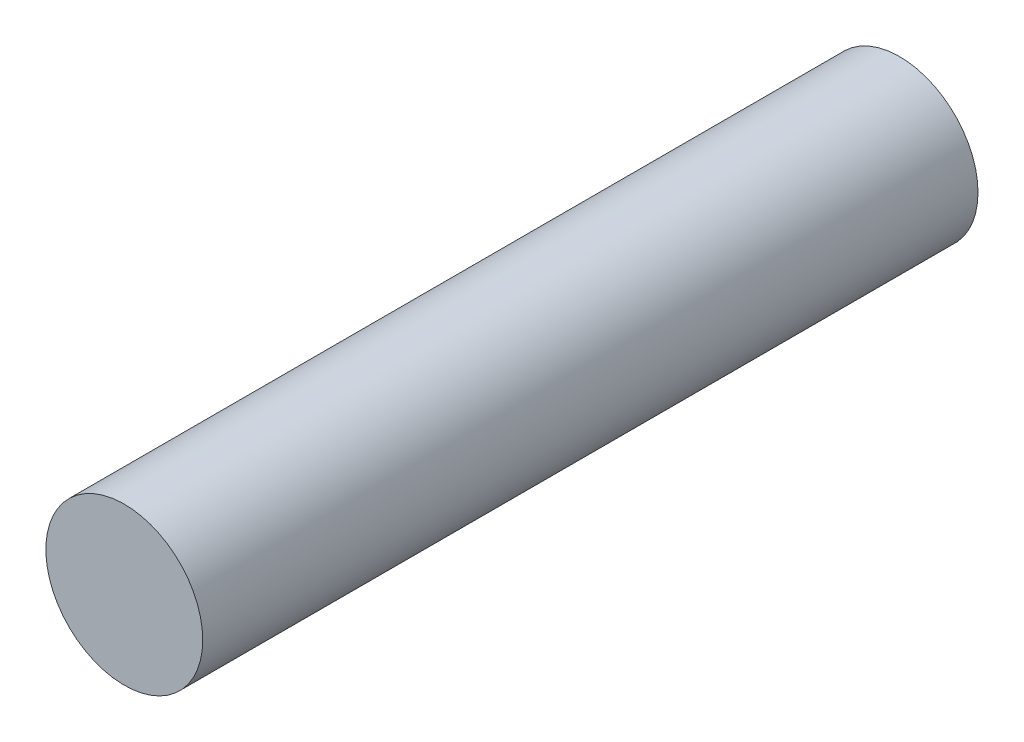
ISO-10303-21;
HEADER;
FILE_DESCRIPTION(('STEP AP214'),'2;1');
FILE_NAME('part.step','',(''),(''),'','','');
FILE_SCHEMA(('AUTOMOTIVE_DESIGN { 1 0 10303 214 1 1 1 1 }'));
ENDSEC;
DATA;
#1=APPLICATION_CONTEXT('core data for automotive mechanical design processes');
#2=APPLICATION_PROTOCOL_DEFINITION('international standard','automotive_design',2000,#1);
#3=PRODUCT_CONTEXT('',#1,'mechanical');
#4=PRODUCT('Part','Part','',(#3));
#5=PRODUCT_RELATED_PRODUCT_CATEGORY('part','',(#4));
#6=PRODUCT_DEFINITION_FORMATION('','',#4);
#7=PRODUCT_DEFINITION_CONTEXT('part definition',#1,'design');
#8=PRODUCT_DEFINITION('design','',#6,#7);
#9=PRODUCT_DEFINITION_SHAPE('','',#8);
#10=(LENGTH_UNIT() NAMED_UNIT(*) SI_UNIT(.MILLI.,.METRE.));
#11=(NAMED_UNIT(*) PLANE_ANGLE_UNIT() SI_UNIT($,.RADIAN.));
#12=(NAMED_UNIT(*) SI_UNIT($,.STERADIAN.) SOLID_ANGLE_UNIT());
#13=UNCERTAINTY_MEASURE_WITH_UNIT(LENGTH_MEASURE(1.E-05),#10,'distance_accuracy_value','');
#14=(GEOMETRIC_REPRESENTATION_CONTEXT(3) GLOBAL_UNCERTAINTY_ASSIGNED_CONTEXT((#13)) GLOBAL_UNIT_ASSIGNED_CONTEXT((#10,
#11,#12)) REPRESENTATION_CONTEXT('',''));
#15=CARTESIAN_POINT('',(0.,0.,0.));
#16=DIRECTION('',(0.,0.,1.));
#17=DIRECTION('',(1.,0.,0.));
#18=AXIS2_PLACEMENT_3D('',#15,#16,#17);
#19=CARTESIAN_POINT('',(0.,0.,8.4));
#20=DIRECTION('',(0.,0.,-1.));
#21=DIRECTION('',(-1.,0.,0.));
#22=AXIS2_PLACEMENT_3D('',#19,#20,#21);
#23=CYLINDRICAL_SURFACE('',#22,0.85);
#24=CARTESIAN_POINT('',(0.,0.,8.4));
#25=DIRECTION('',(0.,0.,1.));
#26=DIRECTION('',(1.,0.,0.));
#27=AXIS2_PLACEMENT_3D('',#24,#25,#26);
#28=CIRCLE('',#27,0.85);
#29=CARTESIAN_POINT('',(0.85,0.,8.4));
#30=VERTEX_POINT('',#29);
#31=EDGE_CURVE('E10',#30,#30,#28,.T.);
#32=ORIENTED_EDGE('',*,*,#31,.F.);
#33=EDGE_LOOP('',(#32));
#34=FACE_BOUND('',#33,.T.);
#35=CARTESIAN_POINT('',(0.,0.,0.));
#36=DIRECTION('',(0.,0.,1.));
#37=DIRECTION('',(1.,0.,0.));
#38=AXIS2_PLACEMENT_3D('',#35,#36,#37);
#39=CIRCLE('',#38,0.85);
#40=CARTESIAN_POINT('',(0.85,0.,0.));
#41=VERTEX_POINT('',#40);
#42=EDGE_CURVE('E35',#41,#41,#39,.T.);
#43=ORIENTED_EDGE('',*,*,#42,.T.);
#44=EDGE_LOOP('',(#43));
#45=FACE_BOUND('',#44,.T.);
#46=ADVANCED_FACE('F32',(#34,#45),#23,.T.);
#47=CARTESIAN_POINT('',(0.,0.,8.4));
#48=DIRECTION('',(0.,0.,1.));
#49=DIRECTION('',(1.,0.,0.));
#50=AXIS2_PLACEMENT_3D('',#47,#48,#49);
#51=PLANE('',#50);
#52=ORIENTED_EDGE('',*,*,#31,.T.);
#53=EDGE_LOOP('',(#52));
#54=FACE_BOUND('',#53,.T.);
#55=ADVANCED_FACE('F47',(#54),#51,.T.);
#56=CARTESIAN_POINT('',(0.,0.,0.));
#57=DIRECTION('',(0.,0.,1.));
#58=DIRECTION('',(1.,0.,0.));
#59=AXIS2_PLACEMENT_3D('',#56,#57,#58);
#60=PLANE('',#59);
#61=ORIENTED_EDGE('',*,*,#42,.F.);
#62=EDGE_LOOP('',(#61));
#63=FACE_BOUND('',#62,.T.);
#64=ADVANCED_FACE('F45',(#63),#60,.F.);
#65=CLOSED_SHELL('',(#46,#55,#64));
#66=MANIFOLD_SOLID_BREP('B2',#65);
#67=ADVANCED_BREP_SHAPE_REPRESENTATION('',(#18,#66),#14);
#68=SHAPE_DEFINITION_REPRESENTATION(#9,#67);
ENDSEC;
END-ISO-10303-21;
